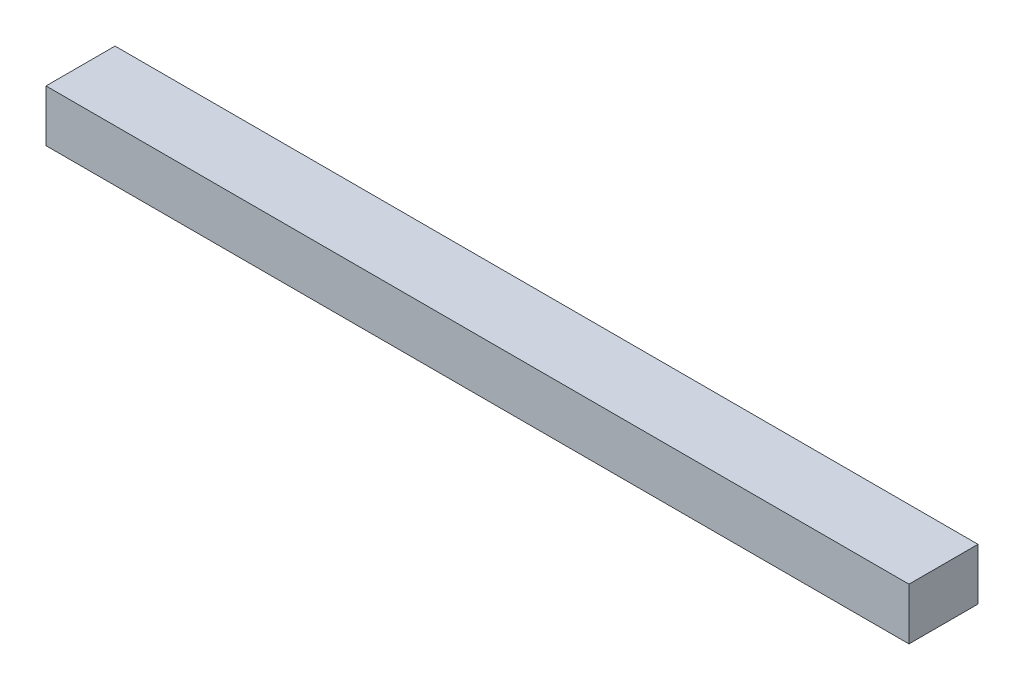
ISO-10303-21;
HEADER;
FILE_DESCRIPTION(('STEP AP214'),'2;1');
FILE_NAME('part.step','',(''),(''),'','','');
FILE_SCHEMA(('AUTOMOTIVE_DESIGN { 1 0 10303 214 1 1 1 1 }'));
ENDSEC;
DATA;
#1=APPLICATION_CONTEXT('core data for automotive mechanical design processes');
#2=APPLICATION_PROTOCOL_DEFINITION('international standard','automotive_design',2000,#1);
#3=PRODUCT_CONTEXT('',#1,'mechanical');
#4=PRODUCT('Part','Part','',(#3));
#5=PRODUCT_RELATED_PRODUCT_CATEGORY('part','',(#4));
#6=PRODUCT_DEFINITION_FORMATION('','',#4);
#7=PRODUCT_DEFINITION_CONTEXT('part definition',#1,'design');
#8=PRODUCT_DEFINITION('design','',#6,#7);
#9=PRODUCT_DEFINITION_SHAPE('','',#8);
#10=(LENGTH_UNIT() NAMED_UNIT(*) SI_UNIT(.MILLI.,.METRE.));
#11=(NAMED_UNIT(*) PLANE_ANGLE_UNIT() SI_UNIT($,.RADIAN.));
#12=(NAMED_UNIT(*) SI_UNIT($,.STERADIAN.) SOLID_ANGLE_UNIT());
#13=UNCERTAINTY_MEASURE_WITH_UNIT(LENGTH_MEASURE(1.E-05),#10,'distance_accuracy_value','');
#14=(GEOMETRIC_REPRESENTATION_CONTEXT(3) GLOBAL_UNCERTAINTY_ASSIGNED_CONTEXT((#13)) GLOBAL_UNIT_ASSIGNED_CONTEXT((#10,
#11,#12)) REPRESENTATION_CONTEXT('',''));
#15=CARTESIAN_POINT('',(0.,0.,0.));
#16=DIRECTION('',(0.,0.,1.));
#17=DIRECTION('',(1.,0.,0.));
#18=AXIS2_PLACEMENT_3D('',#15,#16,#17);
#19=CARTESIAN_POINT('',(0.,3.,0.));
#20=DIRECTION('',(-1.,0.,0.));
#21=DIRECTION('',(0.,0.,1.));
#22=AXIS2_PLACEMENT_3D('',#19,#20,#21);
#23=PLANE('',#22);
#24=DIRECTION('',(0.,0.,-1.));
#25=VECTOR('',#24,1.);
#26=CARTESIAN_POINT('',(0.,0.,0.));
#27=LINE('',#26,#25);
#28=CARTESIAN_POINT('',(0.,0.,0.));
#29=VERTEX_POINT('',#28);
#30=CARTESIAN_POINT('',(0.,0.,-4.));
#31=VERTEX_POINT('',#30);
#32=EDGE_CURVE('E96',#29,#31,#27,.T.);
#33=ORIENTED_EDGE('',*,*,#32,.T.);
#34=DIRECTION('',(0.,-1.,0.));
#35=VECTOR('',#34,1.);
#36=CARTESIAN_POINT('',(0.,3.,-4.));
#37=LINE('',#36,#35);
#38=CARTESIAN_POINT('',(0.,3.,-4.));
#39=VERTEX_POINT('',#38);
#40=EDGE_CURVE('E11',#39,#31,#37,.T.);
#41=ORIENTED_EDGE('',*,*,#40,.F.);
#42=DIRECTION('',(0.,0.,-1.));
#43=VECTOR('',#42,1.);
#44=CARTESIAN_POINT('',(0.,3.,0.));
#45=LINE('',#44,#43);
#46=CARTESIAN_POINT('',(0.,3.,0.));
#47=VERTEX_POINT('',#46);
#48=EDGE_CURVE('E84',#47,#39,#45,.T.);
#49=ORIENTED_EDGE('',*,*,#48,.F.);
#50=DIRECTION('',(0.,-1.,0.));
#51=VECTOR('',#50,1.);
#52=CARTESIAN_POINT('',(0.,3.,0.));
#53=LINE('',#52,#51);
#54=EDGE_CURVE('E92',#47,#29,#53,.T.);
#55=ORIENTED_EDGE('',*,*,#54,.T.);
#56=EDGE_LOOP('',(#33,#41,#49,#55));
#57=FACE_BOUND('',#56,.T.);
#58=ADVANCED_FACE('F33',(#57),#23,.F.);
#59=CARTESIAN_POINT('',(0.,3.,-4.));
#60=DIRECTION('',(0.,0.,1.));
#61=DIRECTION('',(1.,0.,0.));
#62=AXIS2_PLACEMENT_3D('',#59,#60,#61);
#63=PLANE('',#62);
#64=DIRECTION('',(-1.,0.,0.));
#65=VECTOR('',#64,1.);
#66=CARTESIAN_POINT('',(0.,0.,-4.));
#67=LINE('',#66,#65);
#68=CARTESIAN_POINT('',(-50.,0.,-3.99999999999999));
#69=VERTEX_POINT('',#68);
#70=EDGE_CURVE('E88',#31,#69,#67,.T.);
#71=ORIENTED_EDGE('',*,*,#70,.T.);
#72=DIRECTION('',(0.,-1.,0.));
#73=VECTOR('',#72,1.);
#74=CARTESIAN_POINT('',(-50.,3.,-3.99999999999999));
#75=LINE('',#74,#73);
#76=CARTESIAN_POINT('',(-50.,3.,-3.99999999999999));
#77=VERTEX_POINT('',#76);
#78=EDGE_CURVE('E41',#77,#69,#75,.T.);
#79=ORIENTED_EDGE('',*,*,#78,.F.);
#80=DIRECTION('',(-1.,0.,0.));
#81=VECTOR('',#80,1.);
#82=CARTESIAN_POINT('',(0.,3.,-4.));
#83=LINE('',#82,#81);
#84=EDGE_CURVE('E79',#39,#77,#83,.T.);
#85=ORIENTED_EDGE('',*,*,#84,.F.);
#86=ORIENTED_EDGE('',*,*,#40,.T.);
#87=EDGE_LOOP('',(#71,#79,#85,#86));
#88=FACE_BOUND('',#87,.T.);
#89=ADVANCED_FACE('F87',(#88),#63,.F.);
#90=CARTESIAN_POINT('',(-50.,3.,0.));
#91=DIRECTION('',(1.,0.,0.));
#92=DIRECTION('',(0.,0.,-1.));
#93=AXIS2_PLACEMENT_3D('',#90,#91,#92);
#94=PLANE('',#93);
#95=DIRECTION('',(0.,0.,1.));
#96=VECTOR('',#95,1.);
#97=CARTESIAN_POINT('',(-50.,0.,0.));
#98=LINE('',#97,#96);
#99=CARTESIAN_POINT('',(-50.,0.,0.));
#100=VERTEX_POINT('',#99);
#101=EDGE_CURVE('E66',#69,#100,#98,.T.);
#102=ORIENTED_EDGE('',*,*,#101,.T.);
#103=DIRECTION('',(0.,-1.,0.));
#104=VECTOR('',#103,1.);
#105=CARTESIAN_POINT('',(-50.,3.,0.));
#106=LINE('',#105,#104);
#107=CARTESIAN_POINT('',(-50.,3.,0.));
#108=VERTEX_POINT('',#107);
#109=EDGE_CURVE('E89',#108,#100,#106,.T.);
#110=ORIENTED_EDGE('',*,*,#109,.F.);
#111=DIRECTION('',(0.,0.,1.));
#112=VECTOR('',#111,1.);
#113=CARTESIAN_POINT('',(-50.,3.,0.));
#114=LINE('',#113,#112);
#115=EDGE_CURVE('E82',#77,#108,#114,.T.);
#116=ORIENTED_EDGE('',*,*,#115,.F.);
#117=ORIENTED_EDGE('',*,*,#78,.T.);
#118=EDGE_LOOP('',(#102,#110,#116,#117));
#119=FACE_BOUND('',#118,.T.);
#120=ADVANCED_FACE('F90',(#119),#94,.F.);
#121=CARTESIAN_POINT('',(0.,3.,0.));
#122=DIRECTION('',(0.,0.,-1.));
#123=DIRECTION('',(-1.,0.,0.));
#124=AXIS2_PLACEMENT_3D('',#121,#122,#123);
#125=PLANE('',#124);
#126=DIRECTION('',(1.,0.,0.));
#127=VECTOR('',#126,1.);
#128=CARTESIAN_POINT('',(0.,0.,0.));
#129=LINE('',#128,#127);
#130=EDGE_CURVE('E72',#100,#29,#129,.T.);
#131=ORIENTED_EDGE('',*,*,#130,.T.);
#132=ORIENTED_EDGE('',*,*,#54,.F.);
#133=DIRECTION('',(1.,0.,0.));
#134=VECTOR('',#133,1.);
#135=CARTESIAN_POINT('',(0.,3.,0.));
#136=LINE('',#135,#134);
#137=EDGE_CURVE('E49',#108,#47,#136,.T.);
#138=ORIENTED_EDGE('',*,*,#137,.F.);
#139=ORIENTED_EDGE('',*,*,#109,.T.);
#140=EDGE_LOOP('',(#131,#132,#138,#139));
#141=FACE_BOUND('',#140,.T.);
#142=ADVANCED_FACE('F103',(#141),#125,.F.);
#143=CARTESIAN_POINT('',(0.,3.,0.));
#144=DIRECTION('',(0.,1.,0.));
#145=DIRECTION('',(0.,0.,1.));
#146=AXIS2_PLACEMENT_3D('',#143,#144,#145);
#147=PLANE('',#146);
#148=ORIENTED_EDGE('',*,*,#48,.T.);
#149=ORIENTED_EDGE('',*,*,#84,.T.);
#150=ORIENTED_EDGE('',*,*,#115,.T.);
#151=ORIENTED_EDGE('',*,*,#137,.T.);
#152=EDGE_LOOP('',(#148,#149,#150,#151));
#153=FACE_BOUND('',#152,.T.);
#154=ADVANCED_FACE('F80',(#153),#147,.T.);
#155=CARTESIAN_POINT('',(0.,0.,0.));
#156=DIRECTION('',(0.,1.,0.));
#157=DIRECTION('',(0.,0.,1.));
#158=AXIS2_PLACEMENT_3D('',#155,#156,#157);
#159=PLANE('',#158);
#160=ORIENTED_EDGE('',*,*,#32,.F.);
#161=ORIENTED_EDGE('',*,*,#130,.F.);
#162=ORIENTED_EDGE('',*,*,#101,.F.);
#163=ORIENTED_EDGE('',*,*,#70,.F.);
#164=EDGE_LOOP('',(#160,#161,#162,#163));
#165=FACE_BOUND('',#164,.T.);
#166=ADVANCED_FACE('F106',(#165),#159,.F.);
#167=CLOSED_SHELL('',(#58,#89,#120,#142,#154,#166));
#168=MANIFOLD_SOLID_BREP('B2',#167);
#169=ADVANCED_BREP_SHAPE_REPRESENTATION('',(#18,#168),#14);
#170=SHAPE_DEFINITION_REPRESENTATION(#9,#169);
ENDSEC;
END-ISO-10303-21;
